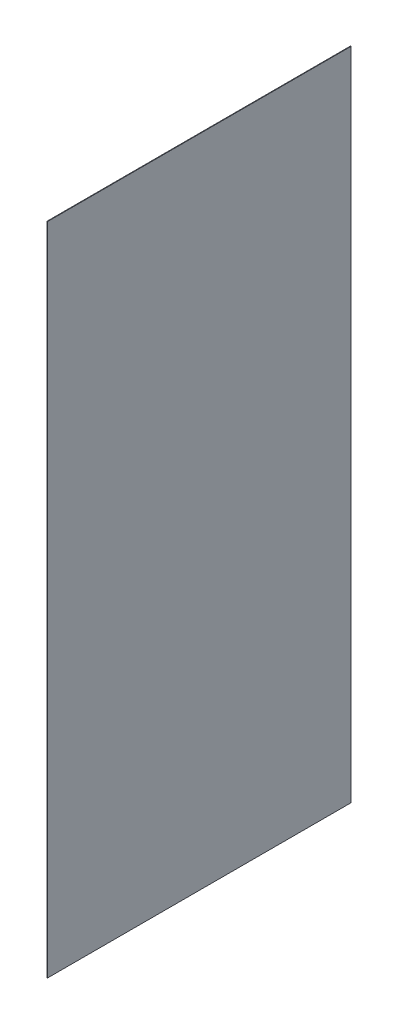
ISO-10303-21;
HEADER;
FILE_DESCRIPTION(('STEP AP214'),'2;1');
FILE_NAME('part.step','',(''),(''),'','','');
FILE_SCHEMA(('AUTOMOTIVE_DESIGN { 1 0 10303 214 1 1 1 1 }'));
ENDSEC;
DATA;
#1=APPLICATION_CONTEXT('core data for automotive mechanical design processes');
#2=APPLICATION_PROTOCOL_DEFINITION('international standard','automotive_design',2000,#1);
#3=PRODUCT_CONTEXT('',#1,'mechanical');
#4=PRODUCT('Part','Part','',(#3));
#5=PRODUCT_RELATED_PRODUCT_CATEGORY('part','',(#4));
#6=PRODUCT_DEFINITION_FORMATION('','',#4);
#7=PRODUCT_DEFINITION_CONTEXT('part definition',#1,'design');
#8=PRODUCT_DEFINITION('design','',#6,#7);
#9=PRODUCT_DEFINITION_SHAPE('','',#8);
#10=(LENGTH_UNIT() NAMED_UNIT(*) SI_UNIT(.MILLI.,.METRE.));
#11=(NAMED_UNIT(*) PLANE_ANGLE_UNIT() SI_UNIT($,.RADIAN.));
#12=(NAMED_UNIT(*) SI_UNIT($,.STERADIAN.) SOLID_ANGLE_UNIT());
#13=UNCERTAINTY_MEASURE_WITH_UNIT(LENGTH_MEASURE(1.E-05),#10,'distance_accuracy_value','');
#14=(GEOMETRIC_REPRESENTATION_CONTEXT(3) GLOBAL_UNCERTAINTY_ASSIGNED_CONTEXT((#13)) GLOBAL_UNIT_ASSIGNED_CONTEXT((#10,
#11,#12)) REPRESENTATION_CONTEXT('',''));
#15=CARTESIAN_POINT('',(0.,0.,0.));
#16=DIRECTION('',(0.,0.,1.));
#17=DIRECTION('',(1.,0.,0.));
#18=AXIS2_PLACEMENT_3D('',#15,#16,#17);
#19=CARTESIAN_POINT('',(0.,200.,-820.));
#20=DIRECTION('',(-1.,0.,0.));
#21=DIRECTION('',(0.,0.,1.));
#22=AXIS2_PLACEMENT_3D('',#19,#20,#21);
#23=PLANE('',#22);
#24=DIRECTION('',(0.,-1.,0.));
#25=VECTOR('',#24,1.);
#26=CARTESIAN_POINT('',(0.,200.,0.));
#27=LINE('',#26,#25);
#28=CARTESIAN_POINT('',(0.,1970.,0.));
#29=VERTEX_POINT('',#28);
#30=CARTESIAN_POINT('',(0.,200.,0.));
#31=VERTEX_POINT('',#30);
#32=EDGE_CURVE('E103',#29,#31,#27,.T.);
#33=ORIENTED_EDGE('',*,*,#32,.F.);
#34=DIRECTION('',(0.,0.,1.));
#35=VECTOR('',#34,1.);
#36=CARTESIAN_POINT('',(0.,1970.,-820.));
#37=LINE('',#36,#35);
#38=CARTESIAN_POINT('',(0.,1970.,-820.));
#39=VERTEX_POINT('',#38);
#40=EDGE_CURVE('E11',#39,#29,#37,.T.);
#41=ORIENTED_EDGE('',*,*,#40,.F.);
#42=DIRECTION('',(0.,-1.,0.));
#43=VECTOR('',#42,1.);
#44=CARTESIAN_POINT('',(0.,200.,-820.));
#45=LINE('',#44,#43);
#46=CARTESIAN_POINT('',(0.,200.,-820.));
#47=VERTEX_POINT('',#46);
#48=EDGE_CURVE('E97',#39,#47,#45,.T.);
#49=ORIENTED_EDGE('',*,*,#48,.T.);
#50=DIRECTION('',(0.,0.,1.));
#51=VECTOR('',#50,1.);
#52=CARTESIAN_POINT('',(0.,200.,-820.));
#53=LINE('',#52,#51);
#54=EDGE_CURVE('E42',#47,#31,#53,.T.);
#55=ORIENTED_EDGE('',*,*,#54,.T.);
#56=EDGE_LOOP('',(#33,#41,#49,#55));
#57=FACE_BOUND('',#56,.T.);
#58=ADVANCED_FACE('F39',(#57),#23,.T.);
#59=CARTESIAN_POINT('',(0.,1970.,-820.));
#60=DIRECTION('',(0.,1.,0.));
#61=DIRECTION('',(0.,0.,1.));
#62=AXIS2_PLACEMENT_3D('',#59,#60,#61);
#63=PLANE('',#62);
#64=DIRECTION('',(-1.,0.,0.));
#65=VECTOR('',#64,1.);
#66=CARTESIAN_POINT('',(0.,1970.,0.));
#67=LINE('',#66,#65);
#68=CARTESIAN_POINT('',(1.5,1970.,0.));
#69=VERTEX_POINT('',#68);
#70=EDGE_CURVE('E99',#69,#29,#67,.T.);
#71=ORIENTED_EDGE('',*,*,#70,.F.);
#72=DIRECTION('',(0.,0.,1.));
#73=VECTOR('',#72,1.);
#74=CARTESIAN_POINT('',(1.5,1970.,-820.));
#75=LINE('',#74,#73);
#76=CARTESIAN_POINT('',(1.5,1970.,-820.));
#77=VERTEX_POINT('',#76);
#78=EDGE_CURVE('E48',#77,#69,#75,.T.);
#79=ORIENTED_EDGE('',*,*,#78,.F.);
#80=DIRECTION('',(-1.,0.,0.));
#81=VECTOR('',#80,1.);
#82=CARTESIAN_POINT('',(0.,1970.,-820.));
#83=LINE('',#82,#81);
#84=EDGE_CURVE('E94',#77,#39,#83,.T.);
#85=ORIENTED_EDGE('',*,*,#84,.T.);
#86=ORIENTED_EDGE('',*,*,#40,.T.);
#87=EDGE_LOOP('',(#71,#79,#85,#86));
#88=FACE_BOUND('',#87,.T.);
#89=ADVANCED_FACE('F113',(#88),#63,.T.);
#90=CARTESIAN_POINT('',(1.5,200.,-820.));
#91=DIRECTION('',(1.,0.,0.));
#92=DIRECTION('',(0.,0.,-1.));
#93=AXIS2_PLACEMENT_3D('',#90,#91,#92);
#94=PLANE('',#93);
#95=DIRECTION('',(0.,1.,0.));
#96=VECTOR('',#95,1.);
#97=CARTESIAN_POINT('',(1.5,200.,0.));
#98=LINE('',#97,#96);
#99=CARTESIAN_POINT('',(1.5,200.,0.));
#100=VERTEX_POINT('',#99);
#101=EDGE_CURVE('E89',#100,#69,#98,.T.);
#102=ORIENTED_EDGE('',*,*,#101,.F.);
#103=DIRECTION('',(0.,0.,1.));
#104=VECTOR('',#103,1.);
#105=CARTESIAN_POINT('',(1.5,200.,-820.));
#106=LINE('',#105,#104);
#107=CARTESIAN_POINT('',(1.5,200.,-820.));
#108=VERTEX_POINT('',#107);
#109=EDGE_CURVE('E84',#108,#100,#106,.T.);
#110=ORIENTED_EDGE('',*,*,#109,.F.);
#111=DIRECTION('',(0.,1.,0.));
#112=VECTOR('',#111,1.);
#113=CARTESIAN_POINT('',(1.5,200.,-820.));
#114=LINE('',#113,#112);
#115=EDGE_CURVE('E87',#108,#77,#114,.T.);
#116=ORIENTED_EDGE('',*,*,#115,.T.);
#117=ORIENTED_EDGE('',*,*,#78,.T.);
#118=EDGE_LOOP('',(#102,#110,#116,#117));
#119=FACE_BOUND('',#118,.T.);
#120=ADVANCED_FACE('F86',(#119),#94,.T.);
#121=CARTESIAN_POINT('',(0.,200.,-820.));
#122=DIRECTION('',(0.,-1.,0.));
#123=DIRECTION('',(0.,0.,-1.));
#124=AXIS2_PLACEMENT_3D('',#121,#122,#123);
#125=PLANE('',#124);
#126=DIRECTION('',(1.,0.,0.));
#127=VECTOR('',#126,1.);
#128=CARTESIAN_POINT('',(0.,200.,0.));
#129=LINE('',#128,#127);
#130=EDGE_CURVE('E106',#31,#100,#129,.T.);
#131=ORIENTED_EDGE('',*,*,#130,.F.);
#132=ORIENTED_EDGE('',*,*,#54,.F.);
#133=DIRECTION('',(1.,0.,0.));
#134=VECTOR('',#133,1.);
#135=CARTESIAN_POINT('',(0.,200.,-820.));
#136=LINE('',#135,#134);
#137=EDGE_CURVE('E93',#47,#108,#136,.T.);
#138=ORIENTED_EDGE('',*,*,#137,.T.);
#139=ORIENTED_EDGE('',*,*,#109,.T.);
#140=EDGE_LOOP('',(#131,#132,#138,#139));
#141=FACE_BOUND('',#140,.T.);
#142=ADVANCED_FACE('F96',(#141),#125,.T.);
#143=CARTESIAN_POINT('',(0.,0.,-820.));
#144=DIRECTION('',(0.,0.,-1.));
#145=DIRECTION('',(-1.,0.,0.));
#146=AXIS2_PLACEMENT_3D('',#143,#144,#145);
#147=PLANE('',#146);
#148=ORIENTED_EDGE('',*,*,#48,.F.);
#149=ORIENTED_EDGE('',*,*,#84,.F.);
#150=ORIENTED_EDGE('',*,*,#115,.F.);
#151=ORIENTED_EDGE('',*,*,#137,.F.);
#152=EDGE_LOOP('',(#148,#149,#150,#151));
#153=FACE_BOUND('',#152,.T.);
#154=ADVANCED_FACE('F92',(#153),#147,.T.);
#155=CARTESIAN_POINT('',(0.,0.,0.));
#156=DIRECTION('',(0.,0.,-1.));
#157=DIRECTION('',(-1.,0.,0.));
#158=AXIS2_PLACEMENT_3D('',#155,#156,#157);
#159=PLANE('',#158);
#160=ORIENTED_EDGE('',*,*,#32,.T.);
#161=ORIENTED_EDGE('',*,*,#130,.T.);
#162=ORIENTED_EDGE('',*,*,#101,.T.);
#163=ORIENTED_EDGE('',*,*,#70,.T.);
#164=EDGE_LOOP('',(#160,#161,#162,#163));
#165=FACE_BOUND('',#164,.T.);
#166=ADVANCED_FACE('F112',(#165),#159,.F.);
#167=CLOSED_SHELL('',(#58,#89,#120,#142,#154,#166));
#168=MANIFOLD_SOLID_BREP('B2',#167);
#169=ADVANCED_BREP_SHAPE_REPRESENTATION('',(#18,#168),#14);
#170=SHAPE_DEFINITION_REPRESENTATION(#9,#169);
ENDSEC;
END-ISO-10303-21;
